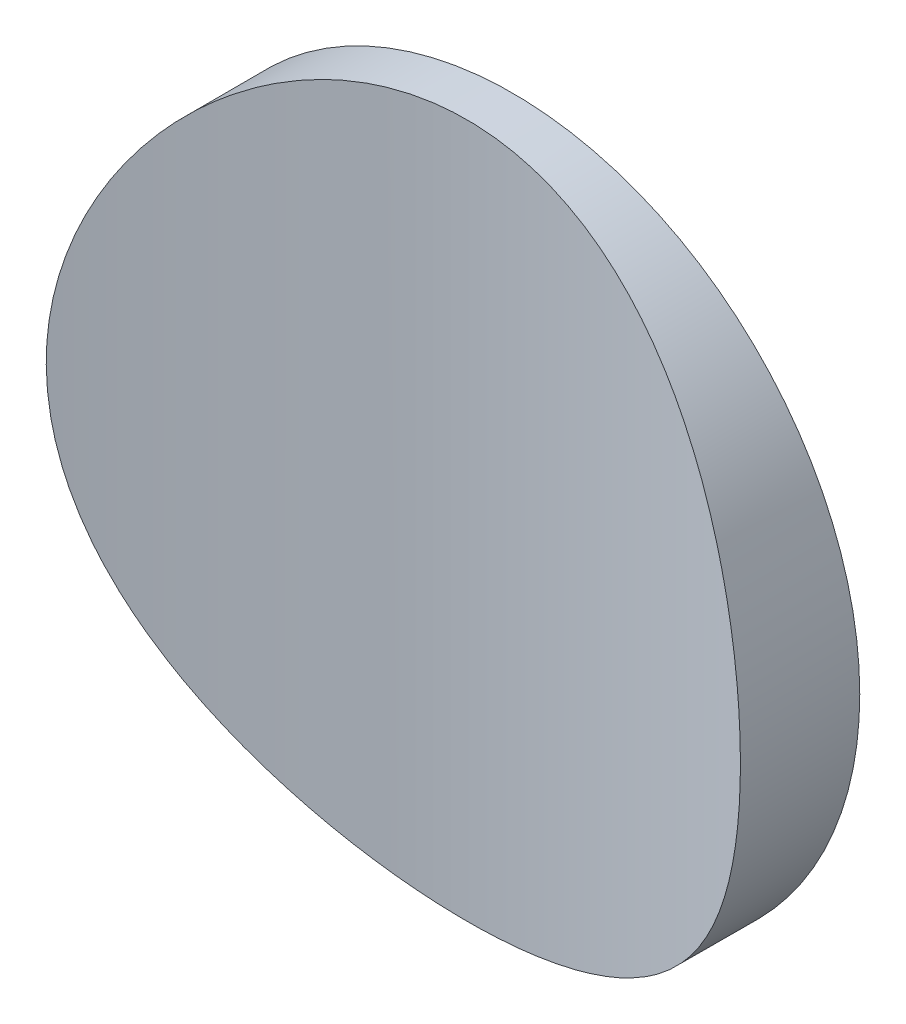
ISO-10303-21;
HEADER;
FILE_DESCRIPTION(('STEP AP214'),'2;1');
FILE_NAME('part.step','',(''),(''),'','','');
FILE_SCHEMA(('AUTOMOTIVE_DESIGN { 1 0 10303 214 1 1 1 1 }'));
ENDSEC;
DATA;
#1=APPLICATION_CONTEXT('core data for automotive mechanical design processes');
#2=APPLICATION_PROTOCOL_DEFINITION('international standard','automotive_design',2000,#1);
#3=PRODUCT_CONTEXT('',#1,'mechanical');
#4=PRODUCT('Part','Part','',(#3));
#5=PRODUCT_RELATED_PRODUCT_CATEGORY('part','',(#4));
#6=PRODUCT_DEFINITION_FORMATION('','',#4);
#7=PRODUCT_DEFINITION_CONTEXT('part definition',#1,'design');
#8=PRODUCT_DEFINITION('design','',#6,#7);
#9=PRODUCT_DEFINITION_SHAPE('','',#8);
#10=(LENGTH_UNIT() NAMED_UNIT(*) SI_UNIT(.MILLI.,.METRE.));
#11=(NAMED_UNIT(*) PLANE_ANGLE_UNIT() SI_UNIT($,.RADIAN.));
#12=(NAMED_UNIT(*) SI_UNIT($,.STERADIAN.) SOLID_ANGLE_UNIT());
#13=UNCERTAINTY_MEASURE_WITH_UNIT(LENGTH_MEASURE(1.E-05),#10,'distance_accuracy_value','');
#14=(GEOMETRIC_REPRESENTATION_CONTEXT(3) GLOBAL_UNCERTAINTY_ASSIGNED_CONTEXT((#13)) GLOBAL_UNIT_ASSIGNED_CONTEXT((#10,
#11,#12)) REPRESENTATION_CONTEXT('',''));
#15=CARTESIAN_POINT('',(0.,0.,0.));
#16=DIRECTION('',(0.,0.,1.));
#17=DIRECTION('',(1.,0.,0.));
#18=AXIS2_PLACEMENT_3D('',#15,#16,#17);
#19=CARTESIAN_POINT('',(0.,-101.55,-22.7));
#20=DIRECTION('',(0.,0.,1.));
#21=DIRECTION('',(1.,0.,0.));
#22=AXIS2_PLACEMENT_3D('',#19,#20,#21);
#23=PLANE('',#22);
#24=CARTESIAN_POINT('',(0.,-101.55,-22.6999999933013));
#25=DIRECTION('',(0.,0.,-1.));
#26=DIRECTION('',(-1.,0.,0.));
#27=AXIS2_PLACEMENT_3D('',#24,#25,#26);
#28=CIRCLE('',#27,1.25000000386752);
#29=CARTESIAN_POINT('',(-1.25000000386755,-101.55,-22.6999999966506));
#30=VERTEX_POINT('',#29);
#31=EDGE_CURVE('E27',#30,#30,#28,.T.);
#32=ORIENTED_EDGE('',*,*,#31,.T.);
#33=EDGE_LOOP('',(#32));
#34=FACE_BOUND('',#33,.T.);
#35=ADVANCED_FACE('F17',(#34),#23,.F.);
#36=CARTESIAN_POINT('',(0.,-101.55,-22.6999999933013));
#37=DIRECTION('',(0.,0.,-1.));
#38=DIRECTION('',(-1.,0.,0.));
#39=AXIS2_PLACEMENT_3D('',#36,#37,#38);
#40=CONICAL_SURFACE('',#39,1.25000000386752,1.04719753333333);
#41=CARTESIAN_POINT('',(0.,-101.55,-22.9141969498693));
#42=DIRECTION('',(0.,0.,1.));
#43=DIRECTION('',(0.,-1.,0.));
#44=AXIS2_PLACEMENT_3D('',#41,#42,#43);
#45=CIRCLE('',#44,1.62100000000001);
#46=CARTESIAN_POINT('',(0.,-103.171,-22.9141969498693));
#47=VERTEX_POINT('',#46);
#48=EDGE_CURVE('E36',#47,#47,#45,.F.);
#49=ORIENTED_EDGE('',*,*,#48,.T.);
#50=EDGE_LOOP('',(#49));
#51=FACE_BOUND('',#50,.T.);
#52=ORIENTED_EDGE('',*,*,#31,.F.);
#53=EDGE_LOOP('',(#52));
#54=FACE_BOUND('',#53,.T.);
#55=ADVANCED_FACE('F34',(#51,#54),#40,.F.);
#56=CARTESIAN_POINT('',(0.,-101.55,-22.9141969498693));
#57=DIRECTION('',(0.,0.,1.));
#58=DIRECTION('',(1.,0.,0.));
#59=AXIS2_PLACEMENT_3D('',#56,#57,#58);
#60=CYLINDRICAL_SURFACE('',#59,1.62100000000001);
#61=CARTESIAN_POINT('',(1.62099999999998,-101.550000042623,-22.3568236216695));
#62=CARTESIAN_POINT('',(1.62099141094523,-101.463300949675,-22.3568317494277));
#63=CARTESIAN_POINT('',(1.61400042492734,-101.376450843036,-22.3599515748011));
#64=CARTESIAN_POINT('',(1.58629997327682,-101.205242732891,-22.3720384196293));
#65=CARTESIAN_POINT('',(1.56555234882877,-101.120892345058,-22.381021702336));
#66=CARTESIAN_POINT('',(1.51126522641326,-100.957463025418,-22.403637644971));
#67=CARTESIAN_POINT('',(1.4777759577916,-100.87836480883,-22.4172520264136));
#68=CARTESIAN_POINT('',(1.39910300233409,-100.726934068793,-22.447569971505));
#69=CARTESIAN_POINT('',(1.35392252328943,-100.654599696904,-22.4642726874296));
#70=CARTESIAN_POINT('',(1.25030827201936,-100.514450728801,-22.4999846724019));
#71=CARTESIAN_POINT('',(1.19129647961329,-100.447082490652,-22.519069428433));
#72=CARTESIAN_POINT('',(1.06290990849699,-100.322870822668,-22.5567727766536));
#73=CARTESIAN_POINT('',(0.993531275593138,-100.266031324895,-22.575391192448));
#74=CARTESIAN_POINT('',(0.842916399342044,-100.16225821696,-22.6109730842635));
#75=CARTESIAN_POINT('',(0.761312845391664,-100.115821067447,-22.6278385512772));
#76=CARTESIAN_POINT('',(0.590646242666979,-100.037524790579,-22.6570968726277));
#77=CARTESIAN_POINT('',(0.50158635467595,-100.005659522768,-22.6694916104229));
#78=CARTESIAN_POINT('',(0.323215720992455,-99.9590115498149,-22.6878774475238));
#79=CARTESIAN_POINT('',(0.234136027621054,-99.9434606972751,-22.6941553940073));
#80=CARTESIAN_POINT('',(0.0544250853267984,-99.9274068356861,-22.700638692958));
#81=CARTESIAN_POINT('',(-0.0362055566901427,-99.9268980693708,-22.7008463687837));
#82=CARTESIAN_POINT('',(-0.2108829070255,-99.9405274896219,-22.6953385144356));
#83=CARTESIAN_POINT('',(-0.295008052055827,-99.9538232946269,-22.6899636357003));
#84=CARTESIAN_POINT('',(-0.459713997599869,-99.9932481257667,-22.6743564626456));
#85=CARTESIAN_POINT('',(-0.54029453723604,-100.01937809476,-22.664123811453));
#86=CARTESIAN_POINT('',(-0.697085393323708,-100.084047757001,-22.6396026839921));
#87=CARTESIAN_POINT('',(-0.773211043451857,-100.122769396012,-22.6252551312779));
#88=CARTESIAN_POINT('',(-0.918081611832244,-100.211350426134,-22.593921881697));
#89=CARTESIAN_POINT('',(-0.986823961229853,-100.261213675251,-22.5769352716259));
#90=CARTESIAN_POINT('',(-1.11988024874277,-100.374563628367,-22.5406950438284));
#91=CARTESIAN_POINT('',(-1.18358653931156,-100.438740466051,-22.5213657915791));
#92=CARTESIAN_POINT('',(-1.2995857192548,-100.576932415563,-22.4834915734349));
#93=CARTESIAN_POINT('',(-1.35187467012334,-100.650950908229,-22.4649468799531));
#94=CARTESIAN_POINT('',(-1.4449968589341,-100.809512401809,-22.4302190430747));
#95=CARTESIAN_POINT('',(-1.48544447008998,-100.894302381597,-22.4141222218645));
#96=CARTESIAN_POINT('',(-1.5512433764889,-101.070316210924,-22.3871294919652));
#97=CARTESIAN_POINT('',(-1.57660478438874,-101.161535704621,-22.3762301002844));
#98=CARTESIAN_POINT('',(-1.61001231744984,-101.341748212417,-22.3617173273508));
#99=CARTESIAN_POINT('',(-1.61903879806928,-101.430525855686,-22.3576923111118));
#100=CARTESIAN_POINT('',(-1.62238586760903,-101.608399268384,-22.3562099396984));
#101=CARTESIAN_POINT('',(-1.61671110390638,-101.697494928391,-22.3587505090017));
#102=CARTESIAN_POINT('',(-1.59171005498341,-101.86793406226,-22.3696896949288));
#103=CARTESIAN_POINT('',(-1.57321061704745,-101.949424453115,-22.3777331319925));
#104=CARTESIAN_POINT('',(-1.52416514542021,-102.108086584808,-22.3983270217556));
#105=CARTESIAN_POINT('',(-1.49361639574961,-102.185257347498,-22.4108784905323));
#106=CARTESIAN_POINT('',(-1.41993887276295,-102.336632728022,-22.4397052240269));
#107=CARTESIAN_POINT('',(-1.37634422238035,-102.410584671411,-22.4561124526835));
#108=CARTESIAN_POINT('',(-1.27828462724469,-102.550466019862,-22.490605089927));
#109=CARTESIAN_POINT('',(-1.22381516697743,-102.616392073991,-22.5086911939535));
#110=CARTESIAN_POINT('',(-1.10065496071001,-102.743573486398,-22.5461673813176));
#111=CARTESIAN_POINT('',(-1.03119687244248,-102.804090256452,-22.5655518232967));
#112=CARTESIAN_POINT('',(-0.882652357440583,-102.91272940206,-22.6021493247025));
#113=CARTESIAN_POINT('',(-0.803565444080649,-102.960851150806,-22.6193622742958));
#114=CARTESIAN_POINT('',(-0.637646544095658,-103.043192926361,-22.6497487299376));
#115=CARTESIAN_POINT('',(-0.550810071135852,-103.077404836054,-22.6629198762868));
#116=CARTESIAN_POINT('',(-0.371947394678888,-103.130501641326,-22.6836843470725));
#117=CARTESIAN_POINT('',(-0.279924125297847,-103.149395111142,-22.691280791627));
#118=CARTESIAN_POINT('',(-0.0999220473019255,-103.170281799055,-22.6996987785034));
#119=CARTESIAN_POINT('',(-0.012082962925035,-103.173318363327,-22.7009384729022));
#120=CARTESIAN_POINT('',(0.162813647323733,-103.165175771573,-22.69764141744));
#121=CARTESIAN_POINT('',(0.249871295276785,-103.153998876413,-22.693105586263));
#122=CARTESIAN_POINT('',(0.417857450499694,-103.118493806505,-22.6789797875609));
#123=CARTESIAN_POINT('',(0.498893036955282,-103.094600313995,-22.6695571206145));
#124=CARTESIAN_POINT('',(0.655786366839071,-103.034802180894,-22.6466740203604));
#125=CARTESIAN_POINT('',(0.731643097030792,-102.998895197942,-22.6332127996781));
#126=CARTESIAN_POINT('',(0.879743385690466,-102.914290105407,-22.6028222158147));
#127=CARTESIAN_POINT('',(0.951675171549087,-102.86509318212,-22.5857650081319));
#128=CARTESIAN_POINT('',(1.08656219509791,-102.756047916852,-22.5502280401817));
#129=CARTESIAN_POINT('',(1.1495143199446,-102.696195897315,-22.5317477900116));
#130=CARTESIAN_POINT('',(1.26881655348304,-102.563033140833,-22.4939778176938));
#131=CARTESIAN_POINT('',(1.32449066043182,-102.489107939302,-22.4747115206922));
#132=CARTESIAN_POINT('',(1.42272350911855,-102.332338633366,-22.4387972694266));
#133=CARTESIAN_POINT('',(1.46527511942512,-102.249489712239,-22.4221507412757));
#134=CARTESIAN_POINT('',(1.53547461917742,-102.077728910967,-22.3937444147908));
#135=CARTESIAN_POINT('',(1.56324410974491,-101.988873496905,-22.3819449333317));
#136=CARTESIAN_POINT('',(1.60312773277825,-101.807297220369,-22.364761077439));
#137=CARTESIAN_POINT('',(1.61529438894262,-101.714590416819,-22.3593551851215));
#138=CARTESIAN_POINT('',(1.62047443275749,-101.597774898304,-22.3570554700591));
#139=CARTESIAN_POINT('',(1.62100236703375,-101.573893205081,-22.3568213817632));
#140=CARTESIAN_POINT('',(1.62099999999998,-101.550000042623,-22.3568236216695));
#141=B_SPLINE_CURVE_WITH_KNOTS('',3,(#61,#62,#63,#64,#65,#66,#67,#68,#69,#70,#71,#72,#73,#74,
#75,#76,#77,#78,#79,#80,#81,#82,#83,#84,#85,#86,#87,#88,#89,#90,#91,#92,#93,#94,#95,#96,#97,#98,
#99,#100,#101,#102,#103,#104,#105,#106,#107,#108,#109,#110,#111,#112,#113,#114,#115,#116,#117,
#118,#119,#120,#121,#122,#123,#124,#125,#126,#127,#128,#129,#130,#131,#132,#133,#134,#135,#136,
#137,#138,#139,#140),.UNSPECIFIED.,.T.,.F.,(4,2,2,2,2,2,2,2,2,2,2,2,2,2,2,2,2,2,2,2,2,2,2,2,2,2,
2,2,2,2,2,2,2,2,2,2,2,2,2,4),(0.,0.26003189294775,0.520788109173194,0.780526863495794,
1.04019442708331,1.31370142315536,1.58731035808549,1.87203892428635,2.15664739765709,
2.42715470452225,2.69755847503838,2.95237948070506,3.20721920953687,3.46591835331875,
3.72470721609233,4.00087966197851,4.27714722585543,4.56160605666708,4.8458739921539,
5.1124310648353,5.37890388342092,5.6296240375029,5.88040073757433,6.14149535370963,
6.40269860969217,6.68380352203368,6.96492264687407,7.24620558473877,7.52733097036926,
7.78970227513526,8.05203185101588,8.30592155621977,8.55986079310056,8.82511921041012,
9.09046935853891,9.37272254894727,9.65512886086569,9.93517465537248,10.2142752378073,
10.2859367056637),.UNSPECIFIED.);
#142=CARTESIAN_POINT('',(1.62099999999998,-101.550000042623,-22.3568236216695));
#143=VERTEX_POINT('',#142);
#144=EDGE_CURVE('E11',#143,#143,#141,.T.);
#145=ORIENTED_EDGE('',*,*,#144,.F.);
#146=EDGE_LOOP('',(#145));
#147=FACE_BOUND('',#146,.T.);
#148=ORIENTED_EDGE('',*,*,#48,.F.);
#149=EDGE_LOOP('',(#148));
#150=FACE_BOUND('',#149,.T.);
#151=ADVANCED_FACE('F42',(#147,#150),#60,.T.);
#152=CARTESIAN_POINT('',(0.,-99.909548,-18.7));
#153=DIRECTION('',(0.,-1.,0.));
#154=DIRECTION('',(1.,0.,0.));
#155=AXIS2_PLACEMENT_3D('',#152,#153,#154);
#156=CYLINDRICAL_SURFACE('',#155,4.);
#157=ORIENTED_EDGE('',*,*,#144,.T.);
#158=EDGE_LOOP('',(#157));
#159=FACE_BOUND('',#158,.T.);
#160=ADVANCED_FACE('F44',(#159),#156,.F.);
#161=CLOSED_SHELL('',(#35,#55,#151,#160));
#162=MANIFOLD_SOLID_BREP('B1',#161);
#163=ADVANCED_BREP_SHAPE_REPRESENTATION('',(#18,#162),#14);
#164=SHAPE_DEFINITION_REPRESENTATION(#9,#163);
ENDSEC;
END-ISO-10303-21;
